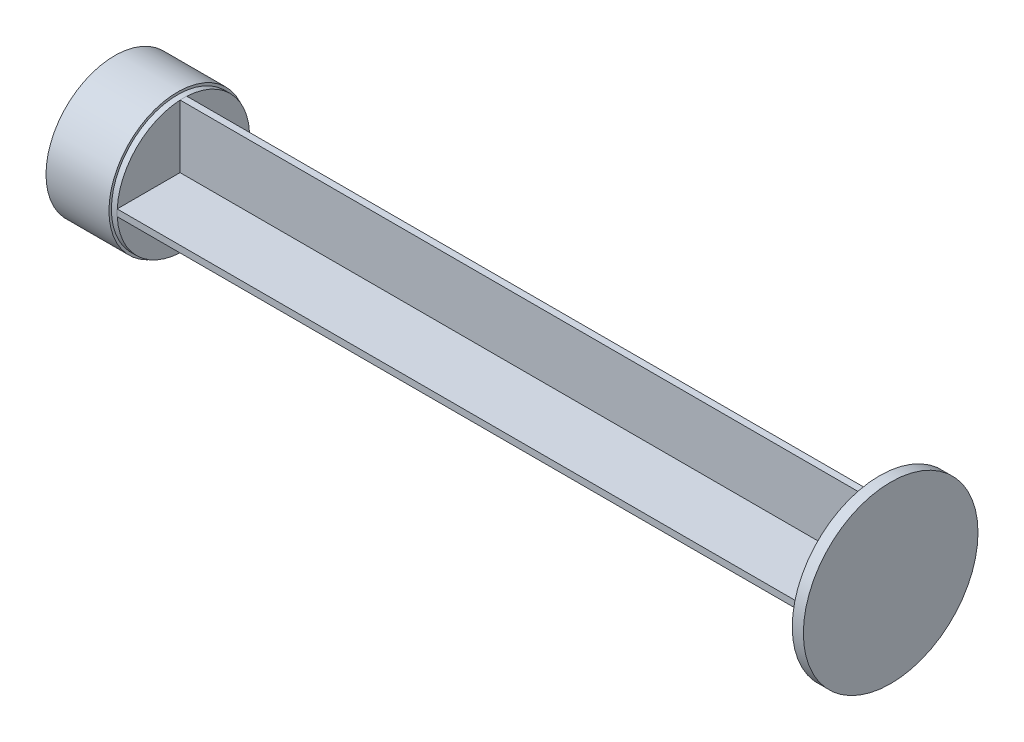
ISO-10303-21;
HEADER;
FILE_DESCRIPTION(('STEP AP214'),'2;1');
FILE_NAME('part.step','',(''),(''),'','','');
FILE_SCHEMA(('AUTOMOTIVE_DESIGN { 1 0 10303 214 1 1 1 1 }'));
ENDSEC;
DATA;
#1=APPLICATION_CONTEXT('core data for automotive mechanical design processes');
#2=APPLICATION_PROTOCOL_DEFINITION('international standard','automotive_design',2000,#1);
#3=PRODUCT_CONTEXT('',#1,'mechanical');
#4=PRODUCT('Part','Part','',(#3));
#5=PRODUCT_RELATED_PRODUCT_CATEGORY('part','',(#4));
#6=PRODUCT_DEFINITION_FORMATION('','',#4);
#7=PRODUCT_DEFINITION_CONTEXT('part definition',#1,'design');
#8=PRODUCT_DEFINITION('design','',#6,#7);
#9=PRODUCT_DEFINITION_SHAPE('','',#8);
#10=(LENGTH_UNIT() NAMED_UNIT(*) SI_UNIT(.MILLI.,.METRE.));
#11=(NAMED_UNIT(*) PLANE_ANGLE_UNIT() SI_UNIT($,.RADIAN.));
#12=(NAMED_UNIT(*) SI_UNIT($,.STERADIAN.) SOLID_ANGLE_UNIT());
#13=UNCERTAINTY_MEASURE_WITH_UNIT(LENGTH_MEASURE(1.E-05),#10,'distance_accuracy_value','');
#14=(GEOMETRIC_REPRESENTATION_CONTEXT(3) GLOBAL_UNCERTAINTY_ASSIGNED_CONTEXT((#13)) GLOBAL_UNIT_ASSIGNED_CONTEXT((#10,
#11,#12)) REPRESENTATION_CONTEXT('',''));
#15=CARTESIAN_POINT('',(0.,0.,0.));
#16=DIRECTION('',(0.,0.,1.));
#17=DIRECTION('',(1.,0.,0.));
#18=AXIS2_PLACEMENT_3D('',#15,#16,#17);
#19=CARTESIAN_POINT('',(0.,0.,0.));
#20=DIRECTION('',(1.,0.,0.));
#21=DIRECTION('',(0.,0.,-1.));
#22=AXIS2_PLACEMENT_3D('',#19,#20,#21);
#23=PLANE('',#22);
#24=CARTESIAN_POINT('',(0.,-14.9,-0.749999999999999));
#25=DIRECTION('',(-1.,0.,0.));
#26=DIRECTION('',(0.,0.,1.));
#27=AXIS2_PLACEMENT_3D('',#24,#25,#26);
#28=CIRCLE('',#27,14.9);
#29=CARTESIAN_POINT('',(0.,-0.0188878103819165,0.));
#30=VERTEX_POINT('',#29);
#31=CARTESIAN_POINT('',(0.,0.,-0.749999999999999));
#32=VERTEX_POINT('',#31);
#33=EDGE_CURVE('E11',#30,#32,#28,.T.);
#34=ORIENTED_EDGE('',*,*,#33,.F.);
#35=DIRECTION('',(0.,-1.,0.));
#36=VECTOR('',#35,1.);
#37=CARTESIAN_POINT('',(0.,0.,0.));
#38=LINE('',#37,#36);
#39=CARTESIAN_POINT('',(0.,0.,0.));
#40=VERTEX_POINT('',#39);
#41=EDGE_CURVE('E271',#40,#30,#38,.T.);
#42=ORIENTED_EDGE('',*,*,#41,.F.);
#43=DIRECTION('',(0.,0.,-1.));
#44=VECTOR('',#43,1.);
#45=CARTESIAN_POINT('',(0.,0.,0.));
#46=LINE('',#45,#44);
#47=EDGE_CURVE('E231',#40,#32,#46,.T.);
#48=ORIENTED_EDGE('',*,*,#47,.T.);
#49=EDGE_LOOP('',(#34,#42,#48));
#50=FACE_BOUND('',#49,.T.);
#51=ADVANCED_FACE('F47',(#50),#23,.F.);
#52=CARTESIAN_POINT('',(0.,-0.0188878103819165,-1.5));
#53=VERTEX_POINT('',#52);
#54=EDGE_CURVE('E57',#32,#53,#28,.T.);
#55=ORIENTED_EDGE('',*,*,#54,.F.);
#56=CARTESIAN_POINT('',(0.,0.,-1.5));
#57=VERTEX_POINT('',#56);
#58=EDGE_CURVE('E314',#32,#57,#46,.T.);
#59=ORIENTED_EDGE('',*,*,#58,.T.);
#60=DIRECTION('',(0.,-1.,0.));
#61=VECTOR('',#60,1.);
#62=CARTESIAN_POINT('',(0.,0.,-1.5));
#63=LINE('',#62,#61);
#64=EDGE_CURVE('E310',#57,#53,#63,.T.);
#65=ORIENTED_EDGE('',*,*,#64,.T.);
#66=EDGE_LOOP('',(#55,#59,#65));
#67=FACE_BOUND('',#66,.T.);
#68=ADVANCED_FACE('F410',(#67),#23,.F.);
#69=CARTESIAN_POINT('',(0.,-14.15,-15.6311121896181));
#70=VERTEX_POINT('',#69);
#71=CARTESIAN_POINT('',(0.,-14.9,-15.65));
#72=VERTEX_POINT('',#71);
#73=EDGE_CURVE('E463',#70,#72,#28,.T.);
#74=ORIENTED_EDGE('',*,*,#73,.F.);
#75=DIRECTION('',(0.,0.,-1.));
#76=VECTOR('',#75,1.);
#77=CARTESIAN_POINT('',(0.,-14.15,0.));
#78=LINE('',#77,#76);
#79=CARTESIAN_POINT('',(0.,-14.15,-15.65));
#80=VERTEX_POINT('',#79);
#81=EDGE_CURVE('E304',#70,#80,#78,.T.);
#82=ORIENTED_EDGE('',*,*,#81,.T.);
#83=DIRECTION('',(0.,-1.,0.));
#84=VECTOR('',#83,1.);
#85=CARTESIAN_POINT('',(0.,0.,-15.65));
#86=LINE('',#85,#84);
#87=EDGE_CURVE('E300',#80,#72,#86,.T.);
#88=ORIENTED_EDGE('',*,*,#87,.T.);
#89=EDGE_LOOP('',(#74,#82,#88));
#90=FACE_BOUND('',#89,.T.);
#91=ADVANCED_FACE('F417',(#90),#23,.F.);
#92=CARTESIAN_POINT('',(0.,-15.65,-15.6311121896181));
#93=VERTEX_POINT('',#92);
#94=EDGE_CURVE('E461',#72,#93,#28,.T.);
#95=ORIENTED_EDGE('',*,*,#94,.F.);
#96=CARTESIAN_POINT('',(0.,-15.65,-15.65));
#97=VERTEX_POINT('',#96);
#98=EDGE_CURVE('E299',#72,#97,#86,.T.);
#99=ORIENTED_EDGE('',*,*,#98,.T.);
#100=DIRECTION('',(0.,0.,-1.));
#101=VECTOR('',#100,1.);
#102=CARTESIAN_POINT('',(0.,-15.65,0.));
#103=LINE('',#102,#101);
#104=EDGE_CURVE('E294',#93,#97,#103,.T.);
#105=ORIENTED_EDGE('',*,*,#104,.F.);
#106=EDGE_LOOP('',(#95,#99,#105));
#107=FACE_BOUND('',#106,.T.);
#108=ADVANCED_FACE('F447',(#107),#23,.F.);
#109=CARTESIAN_POINT('',(0.,-29.7811121896181,-1.5));
#110=VERTEX_POINT('',#109);
#111=CARTESIAN_POINT('',(0.,-29.8,-0.749999999999999));
#112=VERTEX_POINT('',#111);
#113=EDGE_CURVE('E214',#110,#112,#28,.T.);
#114=ORIENTED_EDGE('',*,*,#113,.F.);
#115=DIRECTION('',(0.,-1.,0.));
#116=VECTOR('',#115,1.);
#117=CARTESIAN_POINT('',(0.,0.,-1.5));
#118=LINE('',#117,#116);
#119=CARTESIAN_POINT('',(0.,-29.8,-1.5));
#120=VERTEX_POINT('',#119);
#121=EDGE_CURVE('E289',#110,#120,#118,.T.);
#122=ORIENTED_EDGE('',*,*,#121,.T.);
#123=DIRECTION('',(0.,0.,-1.));
#124=VECTOR('',#123,1.);
#125=CARTESIAN_POINT('',(0.,-29.8,0.));
#126=LINE('',#125,#124);
#127=EDGE_CURVE('E284',#112,#120,#126,.T.);
#128=ORIENTED_EDGE('',*,*,#127,.F.);
#129=EDGE_LOOP('',(#114,#122,#128));
#130=FACE_BOUND('',#129,.T.);
#131=ADVANCED_FACE('F442',(#130),#23,.F.);
#132=CARTESIAN_POINT('',(0.,-29.7811121896181,0.));
#133=VERTEX_POINT('',#132);
#134=EDGE_CURVE('E211',#112,#133,#28,.T.);
#135=ORIENTED_EDGE('',*,*,#134,.F.);
#136=CARTESIAN_POINT('',(0.,-29.8,0.));
#137=VERTEX_POINT('',#136);
#138=EDGE_CURVE('E285',#137,#112,#126,.T.);
#139=ORIENTED_EDGE('',*,*,#138,.F.);
#140=DIRECTION('',(0.,-1.,0.));
#141=VECTOR('',#140,1.);
#142=CARTESIAN_POINT('',(0.,0.,0.));
#143=LINE('',#142,#141);
#144=EDGE_CURVE('E279',#133,#137,#143,.T.);
#145=ORIENTED_EDGE('',*,*,#144,.F.);
#146=EDGE_LOOP('',(#135,#139,#145));
#147=FACE_BOUND('',#146,.T.);
#148=ADVANCED_FACE('F435',(#147),#23,.F.);
#149=CARTESIAN_POINT('',(0.,-14.9,14.15));
#150=VERTEX_POINT('',#149);
#151=CARTESIAN_POINT('',(0.,-14.15,14.1311121896181));
#152=VERTEX_POINT('',#151);
#153=EDGE_CURVE('E197',#150,#152,#28,.T.);
#154=ORIENTED_EDGE('',*,*,#153,.F.);
#155=DIRECTION('',(0.,-1.,0.));
#156=VECTOR('',#155,1.);
#157=CARTESIAN_POINT('',(0.,0.,14.15));
#158=LINE('',#157,#156);
#159=CARTESIAN_POINT('',(0.,-14.15,14.15));
#160=VERTEX_POINT('',#159);
#161=EDGE_CURVE('E179',#160,#150,#158,.T.);
#162=ORIENTED_EDGE('',*,*,#161,.F.);
#163=DIRECTION('',(0.,0.,-1.));
#164=VECTOR('',#163,1.);
#165=CARTESIAN_POINT('',(0.,-14.15,0.));
#166=LINE('',#165,#164);
#167=EDGE_CURVE('E195',#160,#152,#166,.T.);
#168=ORIENTED_EDGE('',*,*,#167,.T.);
#169=EDGE_LOOP('',(#154,#162,#168));
#170=FACE_BOUND('',#169,.T.);
#171=ADVANCED_FACE('F198',(#170),#23,.F.);
#172=CARTESIAN_POINT('',(156.6625,0.,0.));
#173=DIRECTION('',(0.,0.,-1.));
#174=DIRECTION('',(0.,1.,0.));
#175=AXIS2_PLACEMENT_3D('',#172,#173,#174);
#176=PLANE('',#175);
#177=ORIENTED_EDGE('',*,*,#41,.T.);
#178=CARTESIAN_POINT('',(0.,-14.15,0.));
#179=VERTEX_POINT('',#178);
#180=EDGE_CURVE('E223',#30,#179,#38,.T.);
#181=ORIENTED_EDGE('',*,*,#180,.T.);
#182=DIRECTION('',(-1.,0.,0.));
#183=VECTOR('',#182,1.);
#184=CARTESIAN_POINT('',(156.6625,-14.15,0.));
#185=LINE('',#184,#183);
#186=CARTESIAN_POINT('',(156.6625,-14.15,0.));
#187=VERTEX_POINT('',#186);
#188=EDGE_CURVE('E51',#187,#179,#185,.T.);
#189=ORIENTED_EDGE('',*,*,#188,.F.);
#190=DIRECTION('',(0.,-1.,0.));
#191=VECTOR('',#190,1.);
#192=CARTESIAN_POINT('',(156.6625,0.,0.));
#193=LINE('',#192,#191);
#194=CARTESIAN_POINT('',(156.6625,0.,0.));
#195=VERTEX_POINT('',#194);
#196=EDGE_CURVE('E227',#195,#187,#193,.T.);
#197=ORIENTED_EDGE('',*,*,#196,.F.);
#198=DIRECTION('',(-1.,0.,0.));
#199=VECTOR('',#198,1.);
#200=CARTESIAN_POINT('',(156.6625,0.,0.));
#201=LINE('',#200,#199);
#202=EDGE_CURVE('E270',#195,#40,#201,.T.);
#203=ORIENTED_EDGE('',*,*,#202,.T.);
#204=EDGE_LOOP('',(#177,#181,#189,#197,#203));
#205=FACE_BOUND('',#204,.T.);
#206=ADVANCED_FACE('F49',(#205),#176,.F.);
#207=CARTESIAN_POINT('',(156.6625,-14.15,0.));
#208=DIRECTION('',(0.,1.,0.));
#209=DIRECTION('',(0.,0.,1.));
#210=AXIS2_PLACEMENT_3D('',#207,#208,#209);
#211=PLANE('',#210);
#212=ORIENTED_EDGE('',*,*,#167,.F.);
#213=DIRECTION('',(-1.,0.,0.));
#214=VECTOR('',#213,1.);
#215=CARTESIAN_POINT('',(156.6625,-14.15,14.15));
#216=LINE('',#215,#214);
#217=CARTESIAN_POINT('',(156.6625,-14.15,14.15));
#218=VERTEX_POINT('',#217);
#219=EDGE_CURVE('E186',#218,#160,#216,.T.);
#220=ORIENTED_EDGE('',*,*,#219,.F.);
#221=DIRECTION('',(0.,0.,-1.));
#222=VECTOR('',#221,1.);
#223=CARTESIAN_POINT('',(156.6625,-14.15,0.));
#224=LINE('',#223,#222);
#225=EDGE_CURVE('E230',#218,#187,#224,.T.);
#226=ORIENTED_EDGE('',*,*,#225,.T.);
#227=ORIENTED_EDGE('',*,*,#188,.T.);
#228=EDGE_CURVE('E66',#152,#179,#166,.T.);
#229=ORIENTED_EDGE('',*,*,#228,.F.);
#230=EDGE_LOOP('',(#212,#220,#226,#227,#229));
#231=FACE_BOUND('',#230,.T.);
#232=ADVANCED_FACE('F440',(#231),#211,.T.);
#233=CARTESIAN_POINT('',(156.6625,0.,14.15));
#234=DIRECTION('',(0.,0.,-1.));
#235=DIRECTION('',(-1.,0.,0.));
#236=AXIS2_PLACEMENT_3D('',#233,#234,#235);
#237=PLANE('',#236);
#238=ORIENTED_EDGE('',*,*,#161,.T.);
#239=CARTESIAN_POINT('',(0.,-15.65,14.15));
#240=VERTEX_POINT('',#239);
#241=EDGE_CURVE('E182',#150,#240,#158,.T.);
#242=ORIENTED_EDGE('',*,*,#241,.T.);
#243=DIRECTION('',(-1.,0.,0.));
#244=VECTOR('',#243,1.);
#245=CARTESIAN_POINT('',(156.6625,-15.65,14.15));
#246=LINE('',#245,#244);
#247=CARTESIAN_POINT('',(156.6625,-15.65,14.15));
#248=VERTEX_POINT('',#247);
#249=EDGE_CURVE('E350',#248,#240,#246,.T.);
#250=ORIENTED_EDGE('',*,*,#249,.F.);
#251=DIRECTION('',(0.,-1.,0.));
#252=VECTOR('',#251,1.);
#253=CARTESIAN_POINT('',(156.6625,0.,14.15));
#254=LINE('',#253,#252);
#255=EDGE_CURVE('E235',#218,#248,#254,.T.);
#256=ORIENTED_EDGE('',*,*,#255,.F.);
#257=ORIENTED_EDGE('',*,*,#219,.T.);
#258=EDGE_LOOP('',(#238,#242,#250,#256,#257));
#259=FACE_BOUND('',#258,.T.);
#260=ADVANCED_FACE('F180',(#259),#237,.F.);
#261=CARTESIAN_POINT('',(156.6625,-15.65,0.));
#262=DIRECTION('',(0.,1.,0.));
#263=DIRECTION('',(0.,0.,1.));
#264=AXIS2_PLACEMENT_3D('',#261,#262,#263);
#265=PLANE('',#264);
#266=DIRECTION('',(0.,0.,-1.));
#267=VECTOR('',#266,1.);
#268=CARTESIAN_POINT('',(0.,-15.65,0.));
#269=LINE('',#268,#267);
#270=CARTESIAN_POINT('',(0.,-15.65,14.1311121896181));
#271=VERTEX_POINT('',#270);
#272=EDGE_CURVE('E193',#240,#271,#269,.T.);
#273=ORIENTED_EDGE('',*,*,#272,.T.);
#274=CARTESIAN_POINT('',(0.,-15.65,0.));
#275=VERTEX_POINT('',#274);
#276=EDGE_CURVE('E190',#271,#275,#269,.T.);
#277=ORIENTED_EDGE('',*,*,#276,.T.);
#278=DIRECTION('',(-1.,0.,0.));
#279=VECTOR('',#278,1.);
#280=CARTESIAN_POINT('',(156.6625,-15.65,0.));
#281=LINE('',#280,#279);
#282=CARTESIAN_POINT('',(156.6625,-15.65,0.));
#283=VERTEX_POINT('',#282);
#284=EDGE_CURVE('E346',#283,#275,#281,.T.);
#285=ORIENTED_EDGE('',*,*,#284,.F.);
#286=DIRECTION('',(0.,0.,-1.));
#287=VECTOR('',#286,1.);
#288=CARTESIAN_POINT('',(156.6625,-15.65,0.));
#289=LINE('',#288,#287);
#290=EDGE_CURVE('E238',#248,#283,#289,.T.);
#291=ORIENTED_EDGE('',*,*,#290,.F.);
#292=ORIENTED_EDGE('',*,*,#249,.T.);
#293=EDGE_LOOP('',(#273,#277,#285,#291,#292));
#294=FACE_BOUND('',#293,.T.);
#295=ADVANCED_FACE('F513',(#294),#265,.F.);
#296=CARTESIAN_POINT('',(156.6625,0.,0.));
#297=DIRECTION('',(0.,0.,-1.));
#298=DIRECTION('',(0.,1.,0.));
#299=AXIS2_PLACEMENT_3D('',#296,#297,#298);
#300=PLANE('',#299);
#301=EDGE_CURVE('E280',#275,#133,#143,.T.);
#302=ORIENTED_EDGE('',*,*,#301,.T.);
#303=ORIENTED_EDGE('',*,*,#144,.T.);
#304=DIRECTION('',(-1.,0.,0.));
#305=VECTOR('',#304,1.);
#306=CARTESIAN_POINT('',(156.6625,-29.8,0.));
#307=LINE('',#306,#305);
#308=CARTESIAN_POINT('',(156.6625,-29.8,0.));
#309=VERTEX_POINT('',#308);
#310=EDGE_CURVE('E342',#309,#137,#307,.T.);
#311=ORIENTED_EDGE('',*,*,#310,.F.);
#312=DIRECTION('',(0.,-1.,0.));
#313=VECTOR('',#312,1.);
#314=CARTESIAN_POINT('',(156.6625,0.,0.));
#315=LINE('',#314,#313);
#316=EDGE_CURVE('E241',#283,#309,#315,.T.);
#317=ORIENTED_EDGE('',*,*,#316,.F.);
#318=ORIENTED_EDGE('',*,*,#284,.T.);
#319=EDGE_LOOP('',(#302,#303,#311,#317,#318));
#320=FACE_BOUND('',#319,.T.);
#321=ADVANCED_FACE('F508',(#320),#300,.F.);
#322=CARTESIAN_POINT('',(156.6625,-29.8,0.));
#323=DIRECTION('',(0.,1.,0.));
#324=DIRECTION('',(0.,0.,1.));
#325=AXIS2_PLACEMENT_3D('',#322,#323,#324);
#326=PLANE('',#325);
#327=ORIENTED_EDGE('',*,*,#138,.T.);
#328=ORIENTED_EDGE('',*,*,#127,.T.);
#329=DIRECTION('',(-1.,0.,0.));
#330=VECTOR('',#329,1.);
#331=CARTESIAN_POINT('',(156.6625,-29.8,-1.5));
#332=LINE('',#331,#330);
#333=CARTESIAN_POINT('',(156.6625,-29.8,-1.5));
#334=VERTEX_POINT('',#333);
#335=EDGE_CURVE('E338',#334,#120,#332,.T.);
#336=ORIENTED_EDGE('',*,*,#335,.F.);
#337=DIRECTION('',(0.,0.,-1.));
#338=VECTOR('',#337,1.);
#339=CARTESIAN_POINT('',(156.6625,-29.8,0.));
#340=LINE('',#339,#338);
#341=EDGE_CURVE('E244',#309,#334,#340,.T.);
#342=ORIENTED_EDGE('',*,*,#341,.F.);
#343=ORIENTED_EDGE('',*,*,#310,.T.);
#344=EDGE_LOOP('',(#327,#328,#336,#342,#343));
#345=FACE_BOUND('',#344,.T.);
#346=ADVANCED_FACE('F455',(#345),#326,.F.);
#347=CARTESIAN_POINT('',(156.6625,0.,-1.5));
#348=DIRECTION('',(0.,0.,-1.));
#349=DIRECTION('',(0.,1.,0.));
#350=AXIS2_PLACEMENT_3D('',#347,#348,#349);
#351=PLANE('',#350);
#352=CARTESIAN_POINT('',(0.,-15.65,-1.5));
#353=VERTEX_POINT('',#352);
#354=EDGE_CURVE('E290',#353,#110,#118,.T.);
#355=ORIENTED_EDGE('',*,*,#354,.F.);
#356=DIRECTION('',(-1.,0.,0.));
#357=VECTOR('',#356,1.);
#358=CARTESIAN_POINT('',(156.6625,-15.65,-1.5));
#359=LINE('',#358,#357);
#360=CARTESIAN_POINT('',(156.6625,-15.65,-1.5));
#361=VERTEX_POINT('',#360);
#362=EDGE_CURVE('E335',#361,#353,#359,.T.);
#363=ORIENTED_EDGE('',*,*,#362,.F.);
#364=DIRECTION('',(0.,-1.,0.));
#365=VECTOR('',#364,1.);
#366=CARTESIAN_POINT('',(156.6625,0.,-1.5));
#367=LINE('',#366,#365);
#368=EDGE_CURVE('E247',#361,#334,#367,.T.);
#369=ORIENTED_EDGE('',*,*,#368,.T.);
#370=ORIENTED_EDGE('',*,*,#335,.T.);
#371=ORIENTED_EDGE('',*,*,#121,.F.);
#372=EDGE_LOOP('',(#355,#363,#369,#370,#371));
#373=FACE_BOUND('',#372,.T.);
#374=ADVANCED_FACE('F503',(#373),#351,.T.);
#375=CARTESIAN_POINT('',(156.6625,-15.65,0.));
#376=DIRECTION('',(0.,1.,0.));
#377=DIRECTION('',(0.,0.,1.));
#378=AXIS2_PLACEMENT_3D('',#375,#376,#377);
#379=PLANE('',#378);
#380=EDGE_CURVE('E295',#353,#93,#103,.T.);
#381=ORIENTED_EDGE('',*,*,#380,.T.);
#382=ORIENTED_EDGE('',*,*,#104,.T.);
#383=DIRECTION('',(-1.,0.,0.));
#384=VECTOR('',#383,1.);
#385=CARTESIAN_POINT('',(156.6625,-15.65,-15.65));
#386=LINE('',#385,#384);
#387=CARTESIAN_POINT('',(156.6625,-15.65,-15.65));
#388=VERTEX_POINT('',#387);
#389=EDGE_CURVE('E331',#388,#97,#386,.T.);
#390=ORIENTED_EDGE('',*,*,#389,.F.);
#391=DIRECTION('',(0.,0.,-1.));
#392=VECTOR('',#391,1.);
#393=CARTESIAN_POINT('',(156.6625,-15.65,0.));
#394=LINE('',#393,#392);
#395=EDGE_CURVE('E251',#361,#388,#394,.T.);
#396=ORIENTED_EDGE('',*,*,#395,.F.);
#397=ORIENTED_EDGE('',*,*,#362,.T.);
#398=EDGE_LOOP('',(#381,#382,#390,#396,#397));
#399=FACE_BOUND('',#398,.T.);
#400=ADVANCED_FACE('F496',(#399),#379,.F.);
#401=CARTESIAN_POINT('',(156.6625,0.,-15.65));
#402=DIRECTION('',(0.,0.,-1.));
#403=DIRECTION('',(-1.,0.,0.));
#404=AXIS2_PLACEMENT_3D('',#401,#402,#403);
#405=PLANE('',#404);
#406=ORIENTED_EDGE('',*,*,#87,.F.);
#407=DIRECTION('',(-1.,0.,0.));
#408=VECTOR('',#407,1.);
#409=CARTESIAN_POINT('',(156.6625,-14.15,-15.65));
#410=LINE('',#409,#408);
#411=CARTESIAN_POINT('',(156.6625,-14.15,-15.65));
#412=VERTEX_POINT('',#411);
#413=EDGE_CURVE('E327',#412,#80,#410,.T.);
#414=ORIENTED_EDGE('',*,*,#413,.F.);
#415=DIRECTION('',(0.,-1.,0.));
#416=VECTOR('',#415,1.);
#417=CARTESIAN_POINT('',(156.6625,0.,-15.65));
#418=LINE('',#417,#416);
#419=EDGE_CURVE('E254',#412,#388,#418,.T.);
#420=ORIENTED_EDGE('',*,*,#419,.T.);
#421=ORIENTED_EDGE('',*,*,#389,.T.);
#422=ORIENTED_EDGE('',*,*,#98,.F.);
#423=EDGE_LOOP('',(#406,#414,#420,#421,#422));
#424=FACE_BOUND('',#423,.T.);
#425=ADVANCED_FACE('F491',(#424),#405,.T.);
#426=CARTESIAN_POINT('',(156.6625,-14.15,0.));
#427=DIRECTION('',(0.,1.,0.));
#428=DIRECTION('',(0.,0.,1.));
#429=AXIS2_PLACEMENT_3D('',#426,#427,#428);
#430=PLANE('',#429);
#431=CARTESIAN_POINT('',(0.,-14.15,-1.5));
#432=VERTEX_POINT('',#431);
#433=EDGE_CURVE('E305',#432,#70,#78,.T.);
#434=ORIENTED_EDGE('',*,*,#433,.F.);
#435=DIRECTION('',(-1.,0.,0.));
#436=VECTOR('',#435,1.);
#437=CARTESIAN_POINT('',(156.6625,-14.15,-1.5));
#438=LINE('',#437,#436);
#439=CARTESIAN_POINT('',(156.6625,-14.15,-1.5));
#440=VERTEX_POINT('',#439);
#441=EDGE_CURVE('E324',#440,#432,#438,.T.);
#442=ORIENTED_EDGE('',*,*,#441,.F.);
#443=DIRECTION('',(0.,0.,-1.));
#444=VECTOR('',#443,1.);
#445=CARTESIAN_POINT('',(156.6625,-14.15,0.));
#446=LINE('',#445,#444);
#447=EDGE_CURVE('E258',#440,#412,#446,.T.);
#448=ORIENTED_EDGE('',*,*,#447,.T.);
#449=ORIENTED_EDGE('',*,*,#413,.T.);
#450=ORIENTED_EDGE('',*,*,#81,.F.);
#451=EDGE_LOOP('',(#434,#442,#448,#449,#450));
#452=FACE_BOUND('',#451,.T.);
#453=ADVANCED_FACE('F485',(#452),#430,.T.);
#454=CARTESIAN_POINT('',(156.6625,0.,-1.5));
#455=DIRECTION('',(0.,0.,-1.));
#456=DIRECTION('',(0.,1.,0.));
#457=AXIS2_PLACEMENT_3D('',#454,#455,#456);
#458=PLANE('',#457);
#459=ORIENTED_EDGE('',*,*,#64,.F.);
#460=DIRECTION('',(-1.,0.,0.));
#461=VECTOR('',#460,1.);
#462=CARTESIAN_POINT('',(156.6625,0.,-1.5));
#463=LINE('',#462,#461);
#464=CARTESIAN_POINT('',(156.6625,0.,-1.5));
#465=VERTEX_POINT('',#464);
#466=EDGE_CURVE('E320',#465,#57,#463,.T.);
#467=ORIENTED_EDGE('',*,*,#466,.F.);
#468=DIRECTION('',(0.,-1.,0.));
#469=VECTOR('',#468,1.);
#470=CARTESIAN_POINT('',(156.6625,0.,-1.5));
#471=LINE('',#470,#469);
#472=EDGE_CURVE('E262',#465,#440,#471,.T.);
#473=ORIENTED_EDGE('',*,*,#472,.T.);
#474=ORIENTED_EDGE('',*,*,#441,.T.);
#475=EDGE_CURVE('E309',#53,#432,#63,.T.);
#476=ORIENTED_EDGE('',*,*,#475,.F.);
#477=EDGE_LOOP('',(#459,#467,#473,#474,#476));
#478=FACE_BOUND('',#477,.T.);
#479=ADVANCED_FACE('F432',(#478),#458,.T.);
#480=CARTESIAN_POINT('',(156.6625,0.,0.));
#481=DIRECTION('',(0.,1.,0.));
#482=DIRECTION('',(0.,0.,1.));
#483=AXIS2_PLACEMENT_3D('',#480,#481,#482);
#484=PLANE('',#483);
#485=ORIENTED_EDGE('',*,*,#47,.F.);
#486=ORIENTED_EDGE('',*,*,#202,.F.);
#487=DIRECTION('',(0.,0.,-1.));
#488=VECTOR('',#487,1.);
#489=CARTESIAN_POINT('',(156.6625,0.,0.));
#490=LINE('',#489,#488);
#491=EDGE_CURVE('E266',#195,#465,#490,.T.);
#492=ORIENTED_EDGE('',*,*,#491,.T.);
#493=ORIENTED_EDGE('',*,*,#466,.T.);
#494=ORIENTED_EDGE('',*,*,#58,.F.);
#495=EDGE_LOOP('',(#485,#486,#492,#493,#494));
#496=FACE_BOUND('',#495,.T.);
#497=ADVANCED_FACE('F423',(#496),#484,.T.);
#498=EDGE_CURVE('E74',#271,#150,#28,.T.);
#499=ORIENTED_EDGE('',*,*,#498,.F.);
#500=ORIENTED_EDGE('',*,*,#272,.F.);
#501=ORIENTED_EDGE('',*,*,#241,.F.);
#502=EDGE_LOOP('',(#499,#500,#501));
#503=FACE_BOUND('',#502,.T.);
#504=ADVANCED_FACE('F192',(#503),#23,.F.);
#505=CARTESIAN_POINT('',(156.6625,-14.9,-0.75));
#506=DIRECTION('',(1.,0.,0.));
#507=DIRECTION('',(0.,0.,-1.));
#508=AXIS2_PLACEMENT_3D('',#505,#506,#507);
#509=PLANE('',#508);
#510=CARTESIAN_POINT('',(156.6625,-14.9,-0.75));
#511=DIRECTION('',(1.,0.,0.));
#512=DIRECTION('',(0.,0.,-1.));
#513=AXIS2_PLACEMENT_3D('',#510,#511,#512);
#514=CIRCLE('',#513,19.65);
#515=CARTESIAN_POINT('',(156.6625,-14.9,-20.4));
#516=VERTEX_POINT('',#515);
#517=EDGE_CURVE('E203',#516,#516,#514,.T.);
#518=ORIENTED_EDGE('',*,*,#517,.F.);
#519=EDGE_LOOP('',(#518));
#520=FACE_BOUND('',#519,.T.);
#521=ORIENTED_EDGE('',*,*,#491,.F.);
#522=ORIENTED_EDGE('',*,*,#196,.T.);
#523=ORIENTED_EDGE('',*,*,#225,.F.);
#524=ORIENTED_EDGE('',*,*,#255,.T.);
#525=ORIENTED_EDGE('',*,*,#290,.T.);
#526=ORIENTED_EDGE('',*,*,#316,.T.);
#527=ORIENTED_EDGE('',*,*,#341,.T.);
#528=ORIENTED_EDGE('',*,*,#368,.F.);
#529=ORIENTED_EDGE('',*,*,#395,.T.);
#530=ORIENTED_EDGE('',*,*,#419,.F.);
#531=ORIENTED_EDGE('',*,*,#447,.F.);
#532=ORIENTED_EDGE('',*,*,#472,.F.);
#533=EDGE_LOOP('',(#521,#522,#523,#524,#525,#526,#527,#528,#529,#530,#531,#532));
#534=FACE_BOUND('',#533,.T.);
#535=ADVANCED_FACE('F422',(#520,#534),#509,.F.);
#536=CARTESIAN_POINT('',(159.1625,-14.9,-0.75));
#537=DIRECTION('',(-1.,0.,0.));
#538=DIRECTION('',(0.,0.,1.));
#539=AXIS2_PLACEMENT_3D('',#536,#537,#538);
#540=CYLINDRICAL_SURFACE('',#539,19.65);
#541=CARTESIAN_POINT('',(159.1625,-14.9,-0.75));
#542=DIRECTION('',(1.,0.,0.));
#543=DIRECTION('',(0.,0.,-1.));
#544=AXIS2_PLACEMENT_3D('',#541,#542,#543);
#545=CIRCLE('',#544,19.65);
#546=CARTESIAN_POINT('',(159.1625,-14.9,-20.4));
#547=VERTEX_POINT('',#546);
#548=EDGE_CURVE('E219',#547,#547,#545,.T.);
#549=ORIENTED_EDGE('',*,*,#548,.F.);
#550=EDGE_LOOP('',(#549));
#551=FACE_BOUND('',#550,.T.);
#552=ORIENTED_EDGE('',*,*,#517,.T.);
#553=EDGE_LOOP('',(#552));
#554=FACE_BOUND('',#553,.T.);
#555=ADVANCED_FACE('F429',(#551,#554),#540,.T.);
#556=CARTESIAN_POINT('',(159.1625,-14.9,-0.75));
#557=DIRECTION('',(1.,0.,0.));
#558=DIRECTION('',(0.,0.,-1.));
#559=AXIS2_PLACEMENT_3D('',#556,#557,#558);
#560=PLANE('',#559);
#561=ORIENTED_EDGE('',*,*,#548,.T.);
#562=EDGE_LOOP('',(#561));
#563=FACE_BOUND('',#562,.T.);
#564=ADVANCED_FACE('F573',(#563),#560,.T.);
#565=CARTESIAN_POINT('',(0.,-14.9,0.));
#566=DIRECTION('',(-1.,0.,0.));
#567=DIRECTION('',(0.,0.,1.));
#568=AXIS2_PLACEMENT_3D('',#565,#566,#567);
#569=PLANE('',#568);
#570=EDGE_CURVE('E369',#53,#70,#28,.T.);
#571=ORIENTED_EDGE('',*,*,#570,.F.);
#572=ORIENTED_EDGE('',*,*,#475,.T.);
#573=ORIENTED_EDGE('',*,*,#433,.T.);
#574=EDGE_LOOP('',(#571,#572,#573));
#575=FACE_BOUND('',#574,.T.);
#576=ADVANCED_FACE('F407',(#575),#569,.F.);
#577=ORIENTED_EDGE('',*,*,#380,.F.);
#578=ORIENTED_EDGE('',*,*,#354,.T.);
#579=EDGE_CURVE('E372',#93,#110,#28,.T.);
#580=ORIENTED_EDGE('',*,*,#579,.F.);
#581=EDGE_LOOP('',(#577,#578,#580));
#582=FACE_BOUND('',#581,.T.);
#583=ADVANCED_FACE('F501',(#582),#569,.F.);
#584=ORIENTED_EDGE('',*,*,#301,.F.);
#585=ORIENTED_EDGE('',*,*,#276,.F.);
#586=EDGE_CURVE('E204',#133,#271,#28,.T.);
#587=ORIENTED_EDGE('',*,*,#586,.F.);
#588=EDGE_LOOP('',(#584,#585,#587));
#589=FACE_BOUND('',#588,.T.);
#590=ADVANCED_FACE('F408',(#589),#569,.F.);
#591=CARTESIAN_POINT('',(-15.465,-14.9,0.));
#592=DIRECTION('',(-1.,0.,0.));
#593=DIRECTION('',(0.,0.,1.));
#594=AXIS2_PLACEMENT_3D('',#591,#592,#593);
#595=PLANE('',#594);
#596=CARTESIAN_POINT('',(-15.465,-14.9,-0.749999999999996));
#597=DIRECTION('',(-1.,0.,0.));
#598=DIRECTION('',(0.,0.,1.));
#599=AXIS2_PLACEMENT_3D('',#596,#597,#598);
#600=CIRCLE('',#599,15.45);
#601=CARTESIAN_POINT('',(-15.465,-14.9,14.7));
#602=VERTEX_POINT('',#601);
#603=EDGE_CURVE('E381',#602,#602,#600,.T.);
#604=ORIENTED_EDGE('',*,*,#603,.T.);
#605=EDGE_LOOP('',(#604));
#606=FACE_BOUND('',#605,.T.);
#607=ADVANCED_FACE('F386',(#606),#595,.T.);
#608=ORIENTED_EDGE('',*,*,#180,.F.);
#609=EDGE_CURVE('E59',#152,#30,#28,.T.);
#610=ORIENTED_EDGE('',*,*,#609,.F.);
#611=ORIENTED_EDGE('',*,*,#228,.T.);
#612=EDGE_LOOP('',(#608,#610,#611));
#613=FACE_BOUND('',#612,.T.);
#614=ADVANCED_FACE('F400',(#613),#569,.F.);
#615=CARTESIAN_POINT('',(-15.465,-14.9,-0.749999999999996));
#616=DIRECTION('',(-1.,0.,0.));
#617=DIRECTION('',(0.,0.,1.));
#618=AXIS2_PLACEMENT_3D('',#615,#616,#617);
#619=CYLINDRICAL_SURFACE('',#618,14.9);
#620=ORIENTED_EDGE('',*,*,#153,.T.);
#621=ORIENTED_EDGE('',*,*,#609,.T.);
#622=ORIENTED_EDGE('',*,*,#33,.T.);
#623=ORIENTED_EDGE('',*,*,#54,.T.);
#624=ORIENTED_EDGE('',*,*,#570,.T.);
#625=ORIENTED_EDGE('',*,*,#73,.T.);
#626=ORIENTED_EDGE('',*,*,#94,.T.);
#627=ORIENTED_EDGE('',*,*,#579,.T.);
#628=ORIENTED_EDGE('',*,*,#113,.T.);
#629=ORIENTED_EDGE('',*,*,#134,.T.);
#630=ORIENTED_EDGE('',*,*,#586,.T.);
#631=ORIENTED_EDGE('',*,*,#498,.T.);
#632=EDGE_LOOP('',(#620,#621,#622,#623,#624,#625,#626,#627,#628,#629,#630,#631));
#633=FACE_BOUND('',#632,.T.);
#634=CARTESIAN_POINT('',(-1.3,-14.9,-0.749999999999999));
#635=DIRECTION('',(-1.,0.,0.));
#636=DIRECTION('',(0.,0.,1.));
#637=AXIS2_PLACEMENT_3D('',#634,#635,#636);
#638=CIRCLE('',#637,14.9);
#639=CARTESIAN_POINT('',(-1.29999999999999,-14.9,14.15));
#640=VERTEX_POINT('',#639);
#641=EDGE_CURVE('E217',#640,#640,#638,.T.);
#642=ORIENTED_EDGE('',*,*,#641,.F.);
#643=EDGE_LOOP('',(#642));
#644=FACE_BOUND('',#643,.T.);
#645=ADVANCED_FACE('F206',(#633,#644),#619,.T.);
#646=CARTESIAN_POINT('',(-1.3,-14.9,0.));
#647=DIRECTION('',(-1.,0.,0.));
#648=DIRECTION('',(0.,0.,1.));
#649=AXIS2_PLACEMENT_3D('',#646,#647,#648);
#650=PLANE('',#649);
#651=CARTESIAN_POINT('',(-1.3,-14.9,-0.749999999999999));
#652=DIRECTION('',(-1.,0.,0.));
#653=DIRECTION('',(0.,0.,1.));
#654=AXIS2_PLACEMENT_3D('',#651,#652,#653);
#655=CIRCLE('',#654,15.45);
#656=CARTESIAN_POINT('',(-1.29999999999999,-14.9,14.7));
#657=VERTEX_POINT('',#656);
#658=EDGE_CURVE('E378',#657,#657,#655,.T.);
#659=ORIENTED_EDGE('',*,*,#658,.F.);
#660=EDGE_LOOP('',(#659));
#661=FACE_BOUND('',#660,.T.);
#662=ORIENTED_EDGE('',*,*,#641,.T.);
#663=EDGE_LOOP('',(#662));
#664=FACE_BOUND('',#663,.T.);
#665=ADVANCED_FACE('F391',(#661,#664),#650,.F.);
#666=CARTESIAN_POINT('',(-15.465,-14.9,-0.749999999999996));
#667=DIRECTION('',(-1.,0.,0.));
#668=DIRECTION('',(0.,0.,1.));
#669=AXIS2_PLACEMENT_3D('',#666,#667,#668);
#670=CYLINDRICAL_SURFACE('',#669,15.45);
#671=ORIENTED_EDGE('',*,*,#603,.F.);
#672=EDGE_LOOP('',(#671));
#673=FACE_BOUND('',#672,.T.);
#674=ORIENTED_EDGE('',*,*,#658,.T.);
#675=EDGE_LOOP('',(#674));
#676=FACE_BOUND('',#675,.T.);
#677=ADVANCED_FACE('F388',(#673,#676),#670,.T.);
#678=CLOSED_SHELL('',(#51,#68,#91,#108,#131,#148,#171,#206,#232,#260,#295,#321,#346,#374,#400,
#425,#453,#479,#497,#504,#535,#555,#564,#576,#583,#590,#607,#614,#645,#665,#677));
#679=MANIFOLD_SOLID_BREP('B2',#678);
#680=ADVANCED_BREP_SHAPE_REPRESENTATION('',(#18,#679),#14);
#681=SHAPE_DEFINITION_REPRESENTATION(#9,#680);
ENDSEC;
END-ISO-10303-21;
